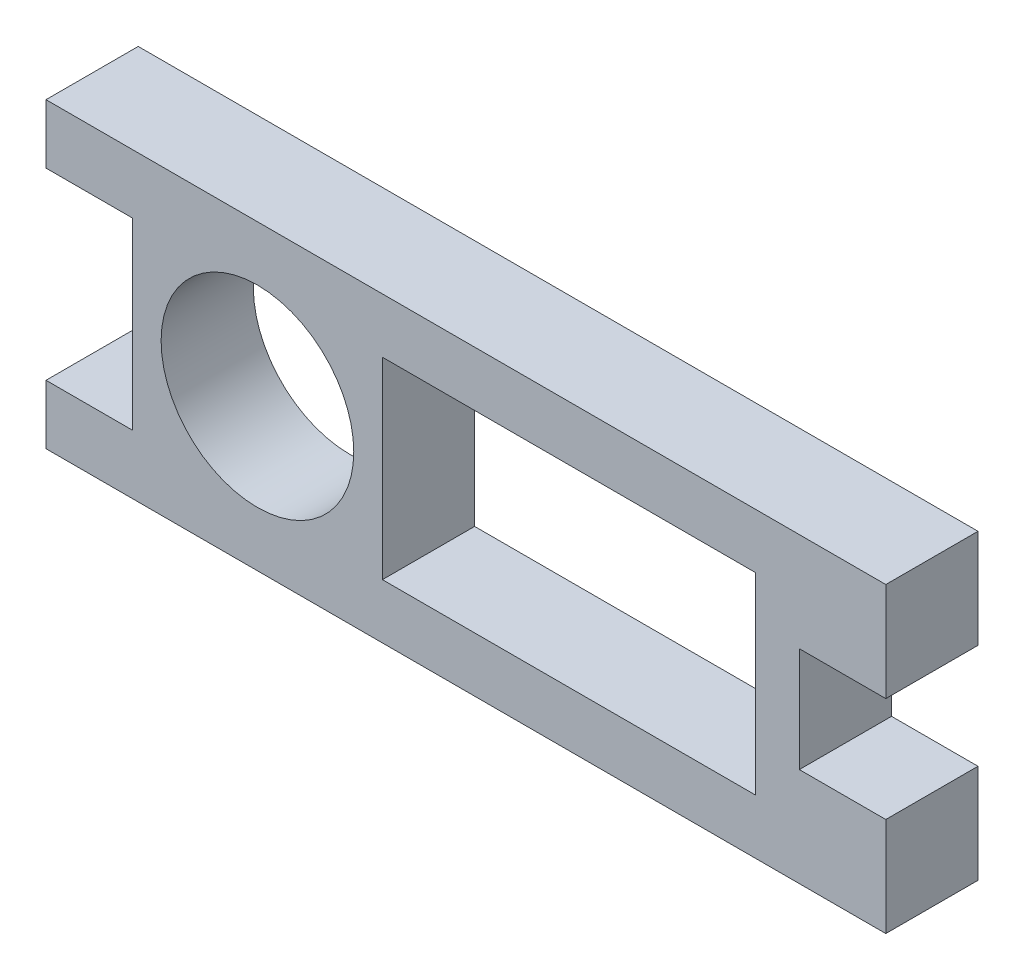
ISO-10303-21;
HEADER;
FILE_DESCRIPTION(('STEP AP214'),'2;1');
FILE_NAME('part.step','',(''),(''),'','','');
FILE_SCHEMA(('AUTOMOTIVE_DESIGN { 1 0 10303 214 1 1 1 1 }'));
ENDSEC;
DATA;
#1=APPLICATION_CONTEXT('core data for automotive mechanical design processes');
#2=APPLICATION_PROTOCOL_DEFINITION('international standard','automotive_design',2000,#1);
#3=PRODUCT_CONTEXT('',#1,'mechanical');
#4=PRODUCT('Part','Part','',(#3));
#5=PRODUCT_RELATED_PRODUCT_CATEGORY('part','',(#4));
#6=PRODUCT_DEFINITION_FORMATION('','',#4);
#7=PRODUCT_DEFINITION_CONTEXT('part definition',#1,'design');
#8=PRODUCT_DEFINITION('design','',#6,#7);
#9=PRODUCT_DEFINITION_SHAPE('','',#8);
#10=(LENGTH_UNIT() NAMED_UNIT(*) SI_UNIT(.MILLI.,.METRE.));
#11=(NAMED_UNIT(*) PLANE_ANGLE_UNIT() SI_UNIT($,.RADIAN.));
#12=(NAMED_UNIT(*) SI_UNIT($,.STERADIAN.) SOLID_ANGLE_UNIT());
#13=UNCERTAINTY_MEASURE_WITH_UNIT(LENGTH_MEASURE(1.E-05),#10,'distance_accuracy_value','');
#14=(GEOMETRIC_REPRESENTATION_CONTEXT(3) GLOBAL_UNCERTAINTY_ASSIGNED_CONTEXT((#13)) GLOBAL_UNIT_ASSIGNED_CONTEXT((#10,
#11,#12)) REPRESENTATION_CONTEXT('',''));
#15=CARTESIAN_POINT('',(0.,0.,0.));
#16=DIRECTION('',(0.,0.,1.));
#17=DIRECTION('',(1.,0.,0.));
#18=AXIS2_PLACEMENT_3D('',#15,#16,#17);
#19=CARTESIAN_POINT('',(0.,0.,5.6));
#20=DIRECTION('',(0.,0.,-1.));
#21=DIRECTION('',(-1.,0.,0.));
#22=AXIS2_PLACEMENT_3D('',#19,#20,#21);
#23=PLANE('',#22);
#24=DIRECTION('',(0.,-1.,0.));
#25=VECTOR('',#24,1.);
#26=CARTESIAN_POINT('',(717.471264670895,391.314983564074,5.6));
#27=LINE('',#26,#25);
#28=CARTESIAN_POINT('',(717.471264670895,403.014983564074,5.6));
#29=VERTEX_POINT('',#28);
#30=CARTESIAN_POINT('',(717.471264670895,391.314983564074,5.6));
#31=VERTEX_POINT('',#30);
#32=EDGE_CURVE('E146',#29,#31,#27,.T.);
#33=ORIENTED_EDGE('',*,*,#32,.F.);
#34=DIRECTION('',(-1.,0.,0.));
#35=VECTOR('',#34,1.);
#36=CARTESIAN_POINT('',(717.471264670895,403.014983564074,5.6));
#37=LINE('',#36,#35);
#38=CARTESIAN_POINT('',(740.140264670895,403.014983564074,5.6));
#39=VERTEX_POINT('',#38);
#40=EDGE_CURVE('E169',#39,#29,#37,.T.);
#41=ORIENTED_EDGE('',*,*,#40,.F.);
#42=DIRECTION('',(0.,1.,0.));
#43=VECTOR('',#42,1.);
#44=CARTESIAN_POINT('',(740.140264670895,391.314983564074,5.6));
#45=LINE('',#44,#43);
#46=CARTESIAN_POINT('',(740.140264670895,391.314983564074,5.6));
#47=VERTEX_POINT('',#46);
#48=EDGE_CURVE('E167',#47,#39,#45,.T.);
#49=ORIENTED_EDGE('',*,*,#48,.F.);
#50=DIRECTION('',(1.,0.,0.));
#51=VECTOR('',#50,1.);
#52=CARTESIAN_POINT('',(717.471264670895,391.314983564074,5.6));
#53=LINE('',#52,#51);
#54=EDGE_CURVE('E154',#31,#47,#53,.T.);
#55=ORIENTED_EDGE('',*,*,#54,.F.);
#56=EDGE_LOOP('',(#33,#41,#49,#55));
#57=FACE_BOUND('',#56,.T.);
#58=DIRECTION('',(1.,0.,0.));
#59=VECTOR('',#58,1.);
#60=CARTESIAN_POINT('',(702.290264670895,402.743983564074,5.6));
#61=LINE('',#60,#59);
#62=CARTESIAN_POINT('',(697.040264670895,402.743983564074,5.6));
#63=VERTEX_POINT('',#62);
#64=CARTESIAN_POINT('',(702.290264670895,402.743983564074,5.6));
#65=VERTEX_POINT('',#64);
#66=EDGE_CURVE('E185',#63,#65,#61,.T.);
#67=ORIENTED_EDGE('',*,*,#66,.T.);
#68=DIRECTION('',(0.,-1.,0.));
#69=VECTOR('',#68,1.);
#70=CARTESIAN_POINT('',(702.290264670895,402.743983564074,5.6));
#71=LINE('',#70,#69);
#72=CARTESIAN_POINT('',(702.290264670895,391.585983564074,5.6));
#73=VERTEX_POINT('',#72);
#74=EDGE_CURVE('E188',#65,#73,#71,.T.);
#75=ORIENTED_EDGE('',*,*,#74,.T.);
#76=DIRECTION('',(-1.,0.,0.));
#77=VECTOR('',#76,1.);
#78=CARTESIAN_POINT('',(697.040264670895,391.585983564074,5.6));
#79=LINE('',#78,#77);
#80=CARTESIAN_POINT('',(697.040264670895,391.585983564074,5.6));
#81=VERTEX_POINT('',#80);
#82=EDGE_CURVE('E191',#73,#81,#79,.T.);
#83=ORIENTED_EDGE('',*,*,#82,.T.);
#84=DIRECTION('',(0.,-1.,0.));
#85=VECTOR('',#84,1.);
#86=CARTESIAN_POINT('',(697.040264670895,387.985983564074,5.6));
#87=LINE('',#86,#85);
#88=CARTESIAN_POINT('',(697.040264670895,387.985983564074,5.6));
#89=VERTEX_POINT('',#88);
#90=EDGE_CURVE('E193',#81,#89,#87,.T.);
#91=ORIENTED_EDGE('',*,*,#90,.T.);
#92=DIRECTION('',(1.,0.,0.));
#93=VECTOR('',#92,1.);
#94=CARTESIAN_POINT('',(748.040264670895,387.985983564074,5.6));
#95=LINE('',#94,#93);
#96=CARTESIAN_POINT('',(748.040264670895,387.985983564074,5.6));
#97=VERTEX_POINT('',#96);
#98=EDGE_CURVE('E195',#89,#97,#95,.T.);
#99=ORIENTED_EDGE('',*,*,#98,.T.);
#100=DIRECTION('',(0.,1.,0.));
#101=VECTOR('',#100,1.);
#102=CARTESIAN_POINT('',(748.040264670895,393.985983564074,5.6));
#103=LINE('',#102,#101);
#104=CARTESIAN_POINT('',(748.040264670895,393.985983564074,5.6));
#105=VERTEX_POINT('',#104);
#106=EDGE_CURVE('E197',#97,#105,#103,.T.);
#107=ORIENTED_EDGE('',*,*,#106,.T.);
#108=DIRECTION('',(-1.,0.,0.));
#109=VECTOR('',#108,1.);
#110=CARTESIAN_POINT('',(742.790264670895,393.985983564074,5.6));
#111=LINE('',#110,#109);
#112=CARTESIAN_POINT('',(742.790264670895,393.985983564074,5.6));
#113=VERTEX_POINT('',#112);
#114=EDGE_CURVE('E199',#105,#113,#111,.T.);
#115=ORIENTED_EDGE('',*,*,#114,.T.);
#116=DIRECTION('',(0.,1.,0.));
#117=VECTOR('',#116,1.);
#118=CARTESIAN_POINT('',(742.790264670895,400.343983564074,5.6));
#119=LINE('',#118,#117);
#120=CARTESIAN_POINT('',(742.790264670895,400.343983564074,5.6));
#121=VERTEX_POINT('',#120);
#122=EDGE_CURVE('E201',#113,#121,#119,.T.);
#123=ORIENTED_EDGE('',*,*,#122,.T.);
#124=DIRECTION('',(1.,0.,0.));
#125=VECTOR('',#124,1.);
#126=CARTESIAN_POINT('',(748.040264670895,400.343983564074,5.6));
#127=LINE('',#126,#125);
#128=CARTESIAN_POINT('',(748.040264670895,400.343983564074,5.6));
#129=VERTEX_POINT('',#128);
#130=EDGE_CURVE('E203',#121,#129,#127,.T.);
#131=ORIENTED_EDGE('',*,*,#130,.T.);
#132=DIRECTION('',(0.,1.,0.));
#133=VECTOR('',#132,1.);
#134=CARTESIAN_POINT('',(748.040264670895,406.343983564074,5.6));
#135=LINE('',#134,#133);
#136=CARTESIAN_POINT('',(748.040264670895,406.343983564074,5.6));
#137=VERTEX_POINT('',#136);
#138=EDGE_CURVE('E205',#129,#137,#135,.T.);
#139=ORIENTED_EDGE('',*,*,#138,.T.);
#140=DIRECTION('',(-1.,0.,0.));
#141=VECTOR('',#140,1.);
#142=CARTESIAN_POINT('',(697.040264670895,406.343983564074,5.6));
#143=LINE('',#142,#141);
#144=CARTESIAN_POINT('',(697.040264670895,406.343983564074,5.6));
#145=VERTEX_POINT('',#144);
#146=EDGE_CURVE('E207',#137,#145,#143,.T.);
#147=ORIENTED_EDGE('',*,*,#146,.T.);
#148=DIRECTION('',(0.,-1.,0.));
#149=VECTOR('',#148,1.);
#150=CARTESIAN_POINT('',(697.040264670895,402.743983564074,5.6));
#151=LINE('',#150,#149);
#152=EDGE_CURVE('E209',#145,#63,#151,.T.);
#153=ORIENTED_EDGE('',*,*,#152,.T.);
#154=EDGE_LOOP('',(#67,#75,#83,#91,#99,#107,#115,#123,#131,#139,#147,#153));
#155=FACE_BOUND('',#154,.T.);
#156=CARTESIAN_POINT('',(709.880764670895,397.164983564074,5.6));
#157=DIRECTION('',(0.,0.,1.));
#158=DIRECTION('',(1.,0.,0.));
#159=AXIS2_PLACEMENT_3D('',#156,#157,#158);
#160=CIRCLE('',#159,5.85000000000002);
#161=CARTESIAN_POINT('',(715.730764670895,397.164983564074,5.6));
#162=VERTEX_POINT('',#161);
#163=EDGE_CURVE('E175',#162,#162,#160,.T.);
#164=ORIENTED_EDGE('',*,*,#163,.F.);
#165=EDGE_LOOP('',(#164));
#166=FACE_BOUND('',#165,.T.);
#167=ADVANCED_FACE('F33',(#57,#155,#166),#23,.F.);
#168=CARTESIAN_POINT('',(0.,0.,0.));
#169=DIRECTION('',(0.,0.,-1.));
#170=DIRECTION('',(-1.,0.,0.));
#171=AXIS2_PLACEMENT_3D('',#168,#169,#170);
#172=PLANE('',#171);
#173=DIRECTION('',(-1.,0.,0.));
#174=VECTOR('',#173,1.);
#175=CARTESIAN_POINT('',(717.471264670895,403.014983564074,0.));
#176=LINE('',#175,#174);
#177=CARTESIAN_POINT('',(740.140264670895,403.014983564074,0.));
#178=VERTEX_POINT('',#177);
#179=CARTESIAN_POINT('',(717.471264670895,403.014983564074,0.));
#180=VERTEX_POINT('',#179);
#181=EDGE_CURVE('E155',#178,#180,#176,.T.);
#182=ORIENTED_EDGE('',*,*,#181,.T.);
#183=DIRECTION('',(0.,-1.,0.));
#184=VECTOR('',#183,1.);
#185=CARTESIAN_POINT('',(717.471264670895,391.314983564074,0.));
#186=LINE('',#185,#184);
#187=CARTESIAN_POINT('',(717.471264670895,391.314983564074,0.));
#188=VERTEX_POINT('',#187);
#189=EDGE_CURVE('E56',#180,#188,#186,.T.);
#190=ORIENTED_EDGE('',*,*,#189,.T.);
#191=DIRECTION('',(1.,0.,0.));
#192=VECTOR('',#191,1.);
#193=CARTESIAN_POINT('',(717.471264670895,391.314983564074,0.));
#194=LINE('',#193,#192);
#195=CARTESIAN_POINT('',(740.140264670895,391.314983564074,0.));
#196=VERTEX_POINT('',#195);
#197=EDGE_CURVE('E161',#188,#196,#194,.T.);
#198=ORIENTED_EDGE('',*,*,#197,.T.);
#199=DIRECTION('',(0.,1.,0.));
#200=VECTOR('',#199,1.);
#201=CARTESIAN_POINT('',(740.140264670895,391.314983564074,0.));
#202=LINE('',#201,#200);
#203=EDGE_CURVE('E177',#196,#178,#202,.T.);
#204=ORIENTED_EDGE('',*,*,#203,.T.);
#205=EDGE_LOOP('',(#182,#190,#198,#204));
#206=FACE_BOUND('',#205,.T.);
#207=DIRECTION('',(1.,0.,0.));
#208=VECTOR('',#207,1.);
#209=CARTESIAN_POINT('',(702.290264670895,402.743983564074,0.));
#210=LINE('',#209,#208);
#211=CARTESIAN_POINT('',(697.040264670895,402.743983564074,0.));
#212=VERTEX_POINT('',#211);
#213=CARTESIAN_POINT('',(702.290264670895,402.743983564074,0.));
#214=VERTEX_POINT('',#213);
#215=EDGE_CURVE('E162',#212,#214,#210,.T.);
#216=ORIENTED_EDGE('',*,*,#215,.F.);
#217=DIRECTION('',(0.,-1.,0.));
#218=VECTOR('',#217,1.);
#219=CARTESIAN_POINT('',(697.040264670895,402.743983564074,0.));
#220=LINE('',#219,#218);
#221=CARTESIAN_POINT('',(697.040264670895,406.343983564074,0.));
#222=VERTEX_POINT('',#221);
#223=EDGE_CURVE('E189',#222,#212,#220,.T.);
#224=ORIENTED_EDGE('',*,*,#223,.F.);
#225=DIRECTION('',(-1.,0.,0.));
#226=VECTOR('',#225,1.);
#227=CARTESIAN_POINT('',(697.040264670895,406.343983564074,0.));
#228=LINE('',#227,#226);
#229=CARTESIAN_POINT('',(748.040264670895,406.343983564074,0.));
#230=VERTEX_POINT('',#229);
#231=EDGE_CURVE('E232',#230,#222,#228,.T.);
#232=ORIENTED_EDGE('',*,*,#231,.F.);
#233=DIRECTION('',(0.,1.,0.));
#234=VECTOR('',#233,1.);
#235=CARTESIAN_POINT('',(748.040264670895,406.343983564074,0.));
#236=LINE('',#235,#234);
#237=CARTESIAN_POINT('',(748.040264670895,400.343983564074,0.));
#238=VERTEX_POINT('',#237);
#239=EDGE_CURVE('E230',#238,#230,#236,.T.);
#240=ORIENTED_EDGE('',*,*,#239,.F.);
#241=DIRECTION('',(1.,0.,0.));
#242=VECTOR('',#241,1.);
#243=CARTESIAN_POINT('',(748.040264670895,400.343983564074,0.));
#244=LINE('',#243,#242);
#245=CARTESIAN_POINT('',(742.790264670895,400.343983564074,0.));
#246=VERTEX_POINT('',#245);
#247=EDGE_CURVE('E228',#246,#238,#244,.T.);
#248=ORIENTED_EDGE('',*,*,#247,.F.);
#249=DIRECTION('',(0.,1.,0.));
#250=VECTOR('',#249,1.);
#251=CARTESIAN_POINT('',(742.790264670895,400.343983564074,0.));
#252=LINE('',#251,#250);
#253=CARTESIAN_POINT('',(742.790264670895,393.985983564074,0.));
#254=VERTEX_POINT('',#253);
#255=EDGE_CURVE('E226',#254,#246,#252,.T.);
#256=ORIENTED_EDGE('',*,*,#255,.F.);
#257=DIRECTION('',(-1.,0.,0.));
#258=VECTOR('',#257,1.);
#259=CARTESIAN_POINT('',(742.790264670895,393.985983564074,0.));
#260=LINE('',#259,#258);
#261=CARTESIAN_POINT('',(748.040264670895,393.985983564074,0.));
#262=VERTEX_POINT('',#261);
#263=EDGE_CURVE('E224',#262,#254,#260,.T.);
#264=ORIENTED_EDGE('',*,*,#263,.F.);
#265=DIRECTION('',(0.,1.,0.));
#266=VECTOR('',#265,1.);
#267=CARTESIAN_POINT('',(748.040264670895,393.985983564074,0.));
#268=LINE('',#267,#266);
#269=CARTESIAN_POINT('',(748.040264670895,387.985983564074,0.));
#270=VERTEX_POINT('',#269);
#271=EDGE_CURVE('E222',#270,#262,#268,.T.);
#272=ORIENTED_EDGE('',*,*,#271,.F.);
#273=DIRECTION('',(1.,0.,0.));
#274=VECTOR('',#273,1.);
#275=CARTESIAN_POINT('',(748.040264670895,387.985983564074,0.));
#276=LINE('',#275,#274);
#277=CARTESIAN_POINT('',(697.040264670895,387.985983564074,0.));
#278=VERTEX_POINT('',#277);
#279=EDGE_CURVE('E220',#278,#270,#276,.T.);
#280=ORIENTED_EDGE('',*,*,#279,.F.);
#281=DIRECTION('',(0.,-1.,0.));
#282=VECTOR('',#281,1.);
#283=CARTESIAN_POINT('',(697.040264670895,387.985983564074,0.));
#284=LINE('',#283,#282);
#285=CARTESIAN_POINT('',(697.040264670895,391.585983564074,0.));
#286=VERTEX_POINT('',#285);
#287=EDGE_CURVE('E218',#286,#278,#284,.T.);
#288=ORIENTED_EDGE('',*,*,#287,.F.);
#289=DIRECTION('',(-1.,0.,0.));
#290=VECTOR('',#289,1.);
#291=CARTESIAN_POINT('',(697.040264670895,391.585983564074,0.));
#292=LINE('',#291,#290);
#293=CARTESIAN_POINT('',(702.290264670895,391.585983564074,0.));
#294=VERTEX_POINT('',#293);
#295=EDGE_CURVE('E216',#294,#286,#292,.T.);
#296=ORIENTED_EDGE('',*,*,#295,.F.);
#297=DIRECTION('',(0.,-1.,0.));
#298=VECTOR('',#297,1.);
#299=CARTESIAN_POINT('',(702.290264670895,402.743983564074,0.));
#300=LINE('',#299,#298);
#301=EDGE_CURVE('E214',#214,#294,#300,.T.);
#302=ORIENTED_EDGE('',*,*,#301,.F.);
#303=EDGE_LOOP('',(#216,#224,#232,#240,#248,#256,#264,#272,#280,#288,#296,#302));
#304=FACE_BOUND('',#303,.T.);
#305=CARTESIAN_POINT('',(709.880764670895,397.164983564074,0.));
#306=DIRECTION('',(0.,0.,1.));
#307=DIRECTION('',(1.,0.,0.));
#308=AXIS2_PLACEMENT_3D('',#305,#306,#307);
#309=CIRCLE('',#308,5.85000000000002);
#310=CARTESIAN_POINT('',(715.730764670895,397.164983564074,0.));
#311=VERTEX_POINT('',#310);
#312=EDGE_CURVE('E486',#311,#311,#309,.T.);
#313=ORIENTED_EDGE('',*,*,#312,.T.);
#314=EDGE_LOOP('',(#313));
#315=FACE_BOUND('',#314,.T.);
#316=ADVANCED_FACE('F274',(#206,#304,#315),#172,.T.);
#317=CARTESIAN_POINT('',(702.290264670895,402.743983564074,5.6));
#318=DIRECTION('',(0.,1.,0.));
#319=DIRECTION('',(0.,0.,1.));
#320=AXIS2_PLACEMENT_3D('',#317,#318,#319);
#321=PLANE('',#320);
#322=ORIENTED_EDGE('',*,*,#215,.T.);
#323=DIRECTION('',(0.,0.,-1.));
#324=VECTOR('',#323,1.);
#325=CARTESIAN_POINT('',(702.290264670895,402.743983564074,5.6));
#326=LINE('',#325,#324);
#327=EDGE_CURVE('E11',#65,#214,#326,.T.);
#328=ORIENTED_EDGE('',*,*,#327,.F.);
#329=ORIENTED_EDGE('',*,*,#66,.F.);
#330=DIRECTION('',(0.,0.,-1.));
#331=VECTOR('',#330,1.);
#332=CARTESIAN_POINT('',(697.040264670895,402.743983564074,5.6));
#333=LINE('',#332,#331);
#334=EDGE_CURVE('E211',#63,#212,#333,.T.);
#335=ORIENTED_EDGE('',*,*,#334,.T.);
#336=EDGE_LOOP('',(#322,#328,#329,#335));
#337=FACE_BOUND('',#336,.T.);
#338=ADVANCED_FACE('F35',(#337),#321,.F.);
#339=CARTESIAN_POINT('',(702.290264670895,402.743983564074,5.6));
#340=DIRECTION('',(1.,0.,0.));
#341=DIRECTION('',(0.,0.,-1.));
#342=AXIS2_PLACEMENT_3D('',#339,#340,#341);
#343=PLANE('',#342);
#344=ORIENTED_EDGE('',*,*,#301,.T.);
#345=DIRECTION('',(0.,0.,-1.));
#346=VECTOR('',#345,1.);
#347=CARTESIAN_POINT('',(702.290264670895,391.585983564074,5.6));
#348=LINE('',#347,#346);
#349=EDGE_CURVE('E41',#73,#294,#348,.T.);
#350=ORIENTED_EDGE('',*,*,#349,.F.);
#351=ORIENTED_EDGE('',*,*,#74,.F.);
#352=ORIENTED_EDGE('',*,*,#327,.T.);
#353=EDGE_LOOP('',(#344,#350,#351,#352));
#354=FACE_BOUND('',#353,.T.);
#355=ADVANCED_FACE('F291',(#354),#343,.F.);
#356=CARTESIAN_POINT('',(697.040264670895,391.585983564074,5.6));
#357=DIRECTION('',(0.,-1.,0.));
#358=DIRECTION('',(0.,0.,-1.));
#359=AXIS2_PLACEMENT_3D('',#356,#357,#358);
#360=PLANE('',#359);
#361=ORIENTED_EDGE('',*,*,#295,.T.);
#362=DIRECTION('',(0.,0.,-1.));
#363=VECTOR('',#362,1.);
#364=CARTESIAN_POINT('',(697.040264670895,391.585983564074,5.6));
#365=LINE('',#364,#363);
#366=EDGE_CURVE('E261',#81,#286,#365,.T.);
#367=ORIENTED_EDGE('',*,*,#366,.F.);
#368=ORIENTED_EDGE('',*,*,#82,.F.);
#369=ORIENTED_EDGE('',*,*,#349,.T.);
#370=EDGE_LOOP('',(#361,#367,#368,#369));
#371=FACE_BOUND('',#370,.T.);
#372=ADVANCED_FACE('F268',(#371),#360,.F.);
#373=CARTESIAN_POINT('',(697.040264670895,387.985983564074,5.6));
#374=DIRECTION('',(1.,0.,0.));
#375=DIRECTION('',(0.,1.,0.));
#376=AXIS2_PLACEMENT_3D('',#373,#374,#375);
#377=PLANE('',#376);
#378=ORIENTED_EDGE('',*,*,#287,.T.);
#379=DIRECTION('',(0.,0.,-1.));
#380=VECTOR('',#379,1.);
#381=CARTESIAN_POINT('',(697.040264670895,387.985983564074,5.6));
#382=LINE('',#381,#380);
#383=EDGE_CURVE('E258',#89,#278,#382,.T.);
#384=ORIENTED_EDGE('',*,*,#383,.F.);
#385=ORIENTED_EDGE('',*,*,#90,.F.);
#386=ORIENTED_EDGE('',*,*,#366,.T.);
#387=EDGE_LOOP('',(#378,#384,#385,#386));
#388=FACE_BOUND('',#387,.T.);
#389=ADVANCED_FACE('F280',(#388),#377,.F.);
#390=CARTESIAN_POINT('',(748.040264670895,387.985983564074,5.6));
#391=DIRECTION('',(0.,1.,0.));
#392=DIRECTION('',(0.,0.,1.));
#393=AXIS2_PLACEMENT_3D('',#390,#391,#392);
#394=PLANE('',#393);
#395=ORIENTED_EDGE('',*,*,#279,.T.);
#396=DIRECTION('',(0.,0.,-1.));
#397=VECTOR('',#396,1.);
#398=CARTESIAN_POINT('',(748.040264670895,387.985983564074,5.6));
#399=LINE('',#398,#397);
#400=EDGE_CURVE('E255',#97,#270,#399,.T.);
#401=ORIENTED_EDGE('',*,*,#400,.F.);
#402=ORIENTED_EDGE('',*,*,#98,.F.);
#403=ORIENTED_EDGE('',*,*,#383,.T.);
#404=EDGE_LOOP('',(#395,#401,#402,#403));
#405=FACE_BOUND('',#404,.T.);
#406=ADVANCED_FACE('F284',(#405),#394,.F.);
#407=CARTESIAN_POINT('',(748.040264670895,393.985983564074,5.6));
#408=DIRECTION('',(-1.,0.,0.));
#409=DIRECTION('',(0.,0.,1.));
#410=AXIS2_PLACEMENT_3D('',#407,#408,#409);
#411=PLANE('',#410);
#412=ORIENTED_EDGE('',*,*,#271,.T.);
#413=DIRECTION('',(0.,0.,-1.));
#414=VECTOR('',#413,1.);
#415=CARTESIAN_POINT('',(748.040264670895,393.985983564074,5.6));
#416=LINE('',#415,#414);
#417=EDGE_CURVE('E252',#105,#262,#416,.T.);
#418=ORIENTED_EDGE('',*,*,#417,.F.);
#419=ORIENTED_EDGE('',*,*,#106,.F.);
#420=ORIENTED_EDGE('',*,*,#400,.T.);
#421=EDGE_LOOP('',(#412,#418,#419,#420));
#422=FACE_BOUND('',#421,.T.);
#423=ADVANCED_FACE('F324',(#422),#411,.F.);
#424=CARTESIAN_POINT('',(742.790264670895,393.985983564074,5.6));
#425=DIRECTION('',(0.,-1.,0.));
#426=DIRECTION('',(0.,0.,-1.));
#427=AXIS2_PLACEMENT_3D('',#424,#425,#426);
#428=PLANE('',#427);
#429=ORIENTED_EDGE('',*,*,#263,.T.);
#430=DIRECTION('',(0.,0.,-1.));
#431=VECTOR('',#430,1.);
#432=CARTESIAN_POINT('',(742.790264670895,393.985983564074,5.6));
#433=LINE('',#432,#431);
#434=EDGE_CURVE('E249',#113,#254,#433,.T.);
#435=ORIENTED_EDGE('',*,*,#434,.F.);
#436=ORIENTED_EDGE('',*,*,#114,.F.);
#437=ORIENTED_EDGE('',*,*,#417,.T.);
#438=EDGE_LOOP('',(#429,#435,#436,#437));
#439=FACE_BOUND('',#438,.T.);
#440=ADVANCED_FACE('F322',(#439),#428,.F.);
#441=CARTESIAN_POINT('',(742.790264670895,400.343983564074,5.6));
#442=DIRECTION('',(-1.,0.,0.));
#443=DIRECTION('',(0.,0.,1.));
#444=AXIS2_PLACEMENT_3D('',#441,#442,#443);
#445=PLANE('',#444);
#446=ORIENTED_EDGE('',*,*,#255,.T.);
#447=DIRECTION('',(0.,0.,-1.));
#448=VECTOR('',#447,1.);
#449=CARTESIAN_POINT('',(742.790264670895,400.343983564074,5.6));
#450=LINE('',#449,#448);
#451=EDGE_CURVE('E246',#121,#246,#450,.T.);
#452=ORIENTED_EDGE('',*,*,#451,.F.);
#453=ORIENTED_EDGE('',*,*,#122,.F.);
#454=ORIENTED_EDGE('',*,*,#434,.T.);
#455=EDGE_LOOP('',(#446,#452,#453,#454));
#456=FACE_BOUND('',#455,.T.);
#457=ADVANCED_FACE('F318',(#456),#445,.F.);
#458=CARTESIAN_POINT('',(748.040264670895,400.343983564074,5.6));
#459=DIRECTION('',(0.,1.,0.));
#460=DIRECTION('',(0.,0.,1.));
#461=AXIS2_PLACEMENT_3D('',#458,#459,#460);
#462=PLANE('',#461);
#463=ORIENTED_EDGE('',*,*,#247,.T.);
#464=DIRECTION('',(0.,0.,-1.));
#465=VECTOR('',#464,1.);
#466=CARTESIAN_POINT('',(748.040264670895,400.343983564074,5.6));
#467=LINE('',#466,#465);
#468=EDGE_CURVE('E243',#129,#238,#467,.T.);
#469=ORIENTED_EDGE('',*,*,#468,.F.);
#470=ORIENTED_EDGE('',*,*,#130,.F.);
#471=ORIENTED_EDGE('',*,*,#451,.T.);
#472=EDGE_LOOP('',(#463,#469,#470,#471));
#473=FACE_BOUND('',#472,.T.);
#474=ADVANCED_FACE('F313',(#473),#462,.F.);
#475=CARTESIAN_POINT('',(748.040264670895,406.343983564074,5.6));
#476=DIRECTION('',(-1.,0.,0.));
#477=DIRECTION('',(0.,0.,1.));
#478=AXIS2_PLACEMENT_3D('',#475,#476,#477);
#479=PLANE('',#478);
#480=ORIENTED_EDGE('',*,*,#239,.T.);
#481=DIRECTION('',(0.,0.,-1.));
#482=VECTOR('',#481,1.);
#483=CARTESIAN_POINT('',(748.040264670895,406.343983564074,5.6));
#484=LINE('',#483,#482);
#485=EDGE_CURVE('E240',#137,#230,#484,.T.);
#486=ORIENTED_EDGE('',*,*,#485,.F.);
#487=ORIENTED_EDGE('',*,*,#138,.F.);
#488=ORIENTED_EDGE('',*,*,#468,.T.);
#489=EDGE_LOOP('',(#480,#486,#487,#488));
#490=FACE_BOUND('',#489,.T.);
#491=ADVANCED_FACE('F307',(#490),#479,.F.);
#492=CARTESIAN_POINT('',(697.040264670895,406.343983564074,5.6));
#493=DIRECTION('',(0.,-1.,0.));
#494=DIRECTION('',(0.,0.,-1.));
#495=AXIS2_PLACEMENT_3D('',#492,#493,#494);
#496=PLANE('',#495);
#497=ORIENTED_EDGE('',*,*,#231,.T.);
#498=DIRECTION('',(0.,0.,-1.));
#499=VECTOR('',#498,1.);
#500=CARTESIAN_POINT('',(697.040264670895,406.343983564074,5.6));
#501=LINE('',#500,#499);
#502=EDGE_CURVE('E237',#145,#222,#501,.T.);
#503=ORIENTED_EDGE('',*,*,#502,.F.);
#504=ORIENTED_EDGE('',*,*,#146,.F.);
#505=ORIENTED_EDGE('',*,*,#485,.T.);
#506=EDGE_LOOP('',(#497,#503,#504,#505));
#507=FACE_BOUND('',#506,.T.);
#508=ADVANCED_FACE('F303',(#507),#496,.F.);
#509=CARTESIAN_POINT('',(697.040264670895,402.743983564074,5.6));
#510=DIRECTION('',(1.,0.,0.));
#511=DIRECTION('',(0.,1.,0.));
#512=AXIS2_PLACEMENT_3D('',#509,#510,#511);
#513=PLANE('',#512);
#514=ORIENTED_EDGE('',*,*,#223,.T.);
#515=ORIENTED_EDGE('',*,*,#334,.F.);
#516=ORIENTED_EDGE('',*,*,#152,.F.);
#517=ORIENTED_EDGE('',*,*,#502,.T.);
#518=EDGE_LOOP('',(#514,#515,#516,#517));
#519=FACE_BOUND('',#518,.T.);
#520=ADVANCED_FACE('F298',(#519),#513,.F.);
#521=CARTESIAN_POINT('',(717.471264670895,391.314983564074,5.6));
#522=DIRECTION('',(1.,0.,0.));
#523=DIRECTION('',(0.,0.,-1.));
#524=AXIS2_PLACEMENT_3D('',#521,#522,#523);
#525=PLANE('',#524);
#526=ORIENTED_EDGE('',*,*,#189,.F.);
#527=DIRECTION('',(0.,0.,-1.));
#528=VECTOR('',#527,1.);
#529=CARTESIAN_POINT('',(717.471264670895,403.014983564074,5.6));
#530=LINE('',#529,#528);
#531=EDGE_CURVE('E150',#29,#180,#530,.T.);
#532=ORIENTED_EDGE('',*,*,#531,.F.);
#533=ORIENTED_EDGE('',*,*,#32,.T.);
#534=DIRECTION('',(0.,0.,-1.));
#535=VECTOR('',#534,1.);
#536=CARTESIAN_POINT('',(717.471264670895,391.314983564074,5.6));
#537=LINE('',#536,#535);
#538=EDGE_CURVE('E149',#31,#188,#537,.T.);
#539=ORIENTED_EDGE('',*,*,#538,.T.);
#540=EDGE_LOOP('',(#526,#532,#533,#539));
#541=FACE_BOUND('',#540,.T.);
#542=ADVANCED_FACE('F148',(#541),#525,.T.);
#543=CARTESIAN_POINT('',(717.471264670895,391.314983564074,5.6));
#544=DIRECTION('',(0.,1.,0.));
#545=DIRECTION('',(0.,0.,1.));
#546=AXIS2_PLACEMENT_3D('',#543,#544,#545);
#547=PLANE('',#546);
#548=ORIENTED_EDGE('',*,*,#197,.F.);
#549=ORIENTED_EDGE('',*,*,#538,.F.);
#550=ORIENTED_EDGE('',*,*,#54,.T.);
#551=DIRECTION('',(0.,0.,-1.));
#552=VECTOR('',#551,1.);
#553=CARTESIAN_POINT('',(740.140264670895,391.314983564074,5.6));
#554=LINE('',#553,#552);
#555=EDGE_CURVE('E163',#47,#196,#554,.T.);
#556=ORIENTED_EDGE('',*,*,#555,.T.);
#557=EDGE_LOOP('',(#548,#549,#550,#556));
#558=FACE_BOUND('',#557,.T.);
#559=ADVANCED_FACE('F158',(#558),#547,.T.);
#560=CARTESIAN_POINT('',(740.140264670895,391.314983564074,5.6));
#561=DIRECTION('',(-1.,0.,0.));
#562=DIRECTION('',(0.,0.,1.));
#563=AXIS2_PLACEMENT_3D('',#560,#561,#562);
#564=PLANE('',#563);
#565=ORIENTED_EDGE('',*,*,#203,.F.);
#566=ORIENTED_EDGE('',*,*,#555,.F.);
#567=ORIENTED_EDGE('',*,*,#48,.T.);
#568=DIRECTION('',(0.,0.,-1.));
#569=VECTOR('',#568,1.);
#570=CARTESIAN_POINT('',(740.140264670895,403.014983564074,5.6));
#571=LINE('',#570,#569);
#572=EDGE_CURVE('E48',#39,#178,#571,.T.);
#573=ORIENTED_EDGE('',*,*,#572,.T.);
#574=EDGE_LOOP('',(#565,#566,#567,#573));
#575=FACE_BOUND('',#574,.T.);
#576=ADVANCED_FACE('F383',(#575),#564,.T.);
#577=CARTESIAN_POINT('',(717.471264670895,403.014983564074,5.6));
#578=DIRECTION('',(0.,-1.,0.));
#579=DIRECTION('',(0.,0.,-1.));
#580=AXIS2_PLACEMENT_3D('',#577,#578,#579);
#581=PLANE('',#580);
#582=ORIENTED_EDGE('',*,*,#181,.F.);
#583=ORIENTED_EDGE('',*,*,#572,.F.);
#584=ORIENTED_EDGE('',*,*,#40,.T.);
#585=ORIENTED_EDGE('',*,*,#531,.T.);
#586=EDGE_LOOP('',(#582,#583,#584,#585));
#587=FACE_BOUND('',#586,.T.);
#588=ADVANCED_FACE('F389',(#587),#581,.T.);
#589=CARTESIAN_POINT('',(709.880764670895,397.164983564074,5.6));
#590=DIRECTION('',(0.,0.,-1.));
#591=DIRECTION('',(-1.,0.,0.));
#592=AXIS2_PLACEMENT_3D('',#589,#590,#591);
#593=CYLINDRICAL_SURFACE('',#592,5.85000000000002);
#594=ORIENTED_EDGE('',*,*,#163,.T.);
#595=EDGE_LOOP('',(#594));
#596=FACE_BOUND('',#595,.T.);
#597=ORIENTED_EDGE('',*,*,#312,.F.);
#598=EDGE_LOOP('',(#597));
#599=FACE_BOUND('',#598,.T.);
#600=ADVANCED_FACE('F397',(#596,#599),#593,.F.);
#601=CLOSED_SHELL('',(#167,#316,#338,#355,#372,#389,#406,#423,#440,#457,#474,#491,#508,#520,
#542,#559,#576,#588,#600));
#602=MANIFOLD_SOLID_BREP('B2',#601);
#603=ADVANCED_BREP_SHAPE_REPRESENTATION('',(#18,#602),#14);
#604=SHAPE_DEFINITION_REPRESENTATION(#9,#603);
ENDSEC;
END-ISO-10303-21;
